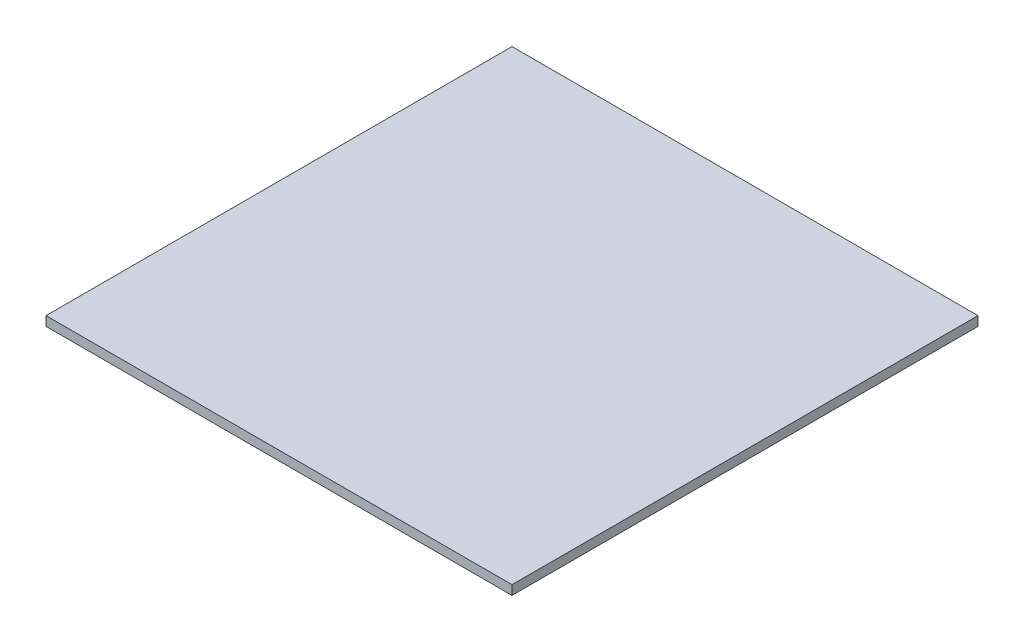
ISO-10303-21;
HEADER;
FILE_DESCRIPTION(('STEP AP214'),'2;1');
FILE_NAME('part.step','',(''),(''),'','','');
FILE_SCHEMA(('AUTOMOTIVE_DESIGN { 1 0 10303 214 1 1 1 1 }'));
ENDSEC;
DATA;
#1=APPLICATION_CONTEXT('core data for automotive mechanical design processes');
#2=APPLICATION_PROTOCOL_DEFINITION('international standard','automotive_design',2000,#1);
#3=PRODUCT_CONTEXT('',#1,'mechanical');
#4=PRODUCT('Part','Part','',(#3));
#5=PRODUCT_RELATED_PRODUCT_CATEGORY('part','',(#4));
#6=PRODUCT_DEFINITION_FORMATION('','',#4);
#7=PRODUCT_DEFINITION_CONTEXT('part definition',#1,'design');
#8=PRODUCT_DEFINITION('design','',#6,#7);
#9=PRODUCT_DEFINITION_SHAPE('','',#8);
#10=(LENGTH_UNIT() NAMED_UNIT(*) SI_UNIT(.MILLI.,.METRE.));
#11=(NAMED_UNIT(*) PLANE_ANGLE_UNIT() SI_UNIT($,.RADIAN.));
#12=(NAMED_UNIT(*) SI_UNIT($,.STERADIAN.) SOLID_ANGLE_UNIT());
#13=UNCERTAINTY_MEASURE_WITH_UNIT(LENGTH_MEASURE(1.E-05),#10,'distance_accuracy_value','');
#14=(GEOMETRIC_REPRESENTATION_CONTEXT(3) GLOBAL_UNCERTAINTY_ASSIGNED_CONTEXT((#13)) GLOBAL_UNIT_ASSIGNED_CONTEXT((#10,
#11,#12)) REPRESENTATION_CONTEXT('',''));
#15=CARTESIAN_POINT('',(0.,0.,0.));
#16=DIRECTION('',(0.,0.,1.));
#17=DIRECTION('',(1.,0.,0.));
#18=AXIS2_PLACEMENT_3D('',#15,#16,#17);
#19=CARTESIAN_POINT('',(0.,2.54,0.));
#20=DIRECTION('',(1.,0.,0.));
#21=DIRECTION('',(0.,0.,-1.));
#22=AXIS2_PLACEMENT_3D('',#19,#20,#21);
#23=PLANE('',#22);
#24=DIRECTION('',(0.,0.,1.));
#25=VECTOR('',#24,1.);
#26=CARTESIAN_POINT('',(0.,0.,0.));
#27=LINE('',#26,#25);
#28=CARTESIAN_POINT('',(0.,0.,-127.));
#29=VERTEX_POINT('',#28);
#30=CARTESIAN_POINT('',(0.,0.,0.));
#31=VERTEX_POINT('',#30);
#32=EDGE_CURVE('E102',#29,#31,#27,.T.);
#33=ORIENTED_EDGE('',*,*,#32,.T.);
#34=DIRECTION('',(0.,-1.,0.));
#35=VECTOR('',#34,1.);
#36=CARTESIAN_POINT('',(0.,2.54,0.));
#37=LINE('',#36,#35);
#38=CARTESIAN_POINT('',(0.,2.54,0.));
#39=VERTEX_POINT('',#38);
#40=EDGE_CURVE('E11',#39,#31,#37,.T.);
#41=ORIENTED_EDGE('',*,*,#40,.F.);
#42=DIRECTION('',(0.,0.,1.));
#43=VECTOR('',#42,1.);
#44=CARTESIAN_POINT('',(0.,2.54,0.));
#45=LINE('',#44,#43);
#46=CARTESIAN_POINT('',(0.,2.54,-127.));
#47=VERTEX_POINT('',#46);
#48=EDGE_CURVE('E90',#47,#39,#45,.T.);
#49=ORIENTED_EDGE('',*,*,#48,.F.);
#50=DIRECTION('',(0.,-1.,0.));
#51=VECTOR('',#50,1.);
#52=CARTESIAN_POINT('',(0.,2.54,-127.));
#53=LINE('',#52,#51);
#54=EDGE_CURVE('E98',#47,#29,#53,.T.);
#55=ORIENTED_EDGE('',*,*,#54,.T.);
#56=EDGE_LOOP('',(#33,#41,#49,#55));
#57=FACE_BOUND('',#56,.T.);
#58=ADVANCED_FACE('F39',(#57),#23,.F.);
#59=CARTESIAN_POINT('',(0.,2.54,0.));
#60=DIRECTION('',(0.,0.,-1.));
#61=DIRECTION('',(-1.,0.,0.));
#62=AXIS2_PLACEMENT_3D('',#59,#60,#61);
#63=PLANE('',#62);
#64=DIRECTION('',(1.,0.,0.));
#65=VECTOR('',#64,1.);
#66=CARTESIAN_POINT('',(0.,0.,0.));
#67=LINE('',#66,#65);
#68=CARTESIAN_POINT('',(127.,0.,0.));
#69=VERTEX_POINT('',#68);
#70=EDGE_CURVE('E94',#31,#69,#67,.T.);
#71=ORIENTED_EDGE('',*,*,#70,.T.);
#72=DIRECTION('',(0.,-1.,0.));
#73=VECTOR('',#72,1.);
#74=CARTESIAN_POINT('',(127.,2.54,0.));
#75=LINE('',#74,#73);
#76=CARTESIAN_POINT('',(127.,2.54,0.));
#77=VERTEX_POINT('',#76);
#78=EDGE_CURVE('E47',#77,#69,#75,.T.);
#79=ORIENTED_EDGE('',*,*,#78,.F.);
#80=DIRECTION('',(1.,0.,0.));
#81=VECTOR('',#80,1.);
#82=CARTESIAN_POINT('',(0.,2.54,0.));
#83=LINE('',#82,#81);
#84=EDGE_CURVE('E85',#39,#77,#83,.T.);
#85=ORIENTED_EDGE('',*,*,#84,.F.);
#86=ORIENTED_EDGE('',*,*,#40,.T.);
#87=EDGE_LOOP('',(#71,#79,#85,#86));
#88=FACE_BOUND('',#87,.T.);
#89=ADVANCED_FACE('F93',(#88),#63,.F.);
#90=CARTESIAN_POINT('',(127.,2.54,0.));
#91=DIRECTION('',(-1.,0.,0.));
#92=DIRECTION('',(0.,0.,1.));
#93=AXIS2_PLACEMENT_3D('',#90,#91,#92);
#94=PLANE('',#93);
#95=DIRECTION('',(0.,0.,-1.));
#96=VECTOR('',#95,1.);
#97=CARTESIAN_POINT('',(127.,0.,0.));
#98=LINE('',#97,#96);
#99=CARTESIAN_POINT('',(127.,0.,-127.));
#100=VERTEX_POINT('',#99);
#101=EDGE_CURVE('E72',#69,#100,#98,.T.);
#102=ORIENTED_EDGE('',*,*,#101,.T.);
#103=DIRECTION('',(0.,-1.,0.));
#104=VECTOR('',#103,1.);
#105=CARTESIAN_POINT('',(127.,2.54,-127.));
#106=LINE('',#105,#104);
#107=CARTESIAN_POINT('',(127.,2.54,-127.));
#108=VERTEX_POINT('',#107);
#109=EDGE_CURVE('E95',#108,#100,#106,.T.);
#110=ORIENTED_EDGE('',*,*,#109,.F.);
#111=DIRECTION('',(0.,0.,-1.));
#112=VECTOR('',#111,1.);
#113=CARTESIAN_POINT('',(127.,2.54,0.));
#114=LINE('',#113,#112);
#115=EDGE_CURVE('E88',#77,#108,#114,.T.);
#116=ORIENTED_EDGE('',*,*,#115,.F.);
#117=ORIENTED_EDGE('',*,*,#78,.T.);
#118=EDGE_LOOP('',(#102,#110,#116,#117));
#119=FACE_BOUND('',#118,.T.);
#120=ADVANCED_FACE('F96',(#119),#94,.F.);
#121=CARTESIAN_POINT('',(0.,2.54,-127.));
#122=DIRECTION('',(0.,0.,1.));
#123=DIRECTION('',(1.,0.,0.));
#124=AXIS2_PLACEMENT_3D('',#121,#122,#123);
#125=PLANE('',#124);
#126=DIRECTION('',(-1.,0.,0.));
#127=VECTOR('',#126,1.);
#128=CARTESIAN_POINT('',(0.,0.,-127.));
#129=LINE('',#128,#127);
#130=EDGE_CURVE('E78',#100,#29,#129,.T.);
#131=ORIENTED_EDGE('',*,*,#130,.T.);
#132=ORIENTED_EDGE('',*,*,#54,.F.);
#133=DIRECTION('',(-1.,0.,0.));
#134=VECTOR('',#133,1.);
#135=CARTESIAN_POINT('',(0.,2.54,-127.));
#136=LINE('',#135,#134);
#137=EDGE_CURVE('E55',#108,#47,#136,.T.);
#138=ORIENTED_EDGE('',*,*,#137,.F.);
#139=ORIENTED_EDGE('',*,*,#109,.T.);
#140=EDGE_LOOP('',(#131,#132,#138,#139));
#141=FACE_BOUND('',#140,.T.);
#142=ADVANCED_FACE('F109',(#141),#125,.F.);
#143=CARTESIAN_POINT('',(0.,2.54,0.));
#144=DIRECTION('',(0.,-1.,0.));
#145=DIRECTION('',(0.,0.,-1.));
#146=AXIS2_PLACEMENT_3D('',#143,#144,#145);
#147=PLANE('',#146);
#148=ORIENTED_EDGE('',*,*,#48,.T.);
#149=ORIENTED_EDGE('',*,*,#84,.T.);
#150=ORIENTED_EDGE('',*,*,#115,.T.);
#151=ORIENTED_EDGE('',*,*,#137,.T.);
#152=EDGE_LOOP('',(#148,#149,#150,#151));
#153=FACE_BOUND('',#152,.T.);
#154=ADVANCED_FACE('F86',(#153),#147,.F.);
#155=CARTESIAN_POINT('',(0.,0.,0.));
#156=DIRECTION('',(0.,-1.,0.));
#157=DIRECTION('',(0.,0.,-1.));
#158=AXIS2_PLACEMENT_3D('',#155,#156,#157);
#159=PLANE('',#158);
#160=ORIENTED_EDGE('',*,*,#32,.F.);
#161=ORIENTED_EDGE('',*,*,#130,.F.);
#162=ORIENTED_EDGE('',*,*,#101,.F.);
#163=ORIENTED_EDGE('',*,*,#70,.F.);
#164=EDGE_LOOP('',(#160,#161,#162,#163));
#165=FACE_BOUND('',#164,.T.);
#166=ADVANCED_FACE('F112',(#165),#159,.T.);
#167=CLOSED_SHELL('',(#58,#89,#120,#142,#154,#166));
#168=MANIFOLD_SOLID_BREP('B2',#167);
#169=ADVANCED_BREP_SHAPE_REPRESENTATION('',(#18,#168),#14);
#170=SHAPE_DEFINITION_REPRESENTATION(#9,#169);
ENDSEC;
END-ISO-10303-21;
